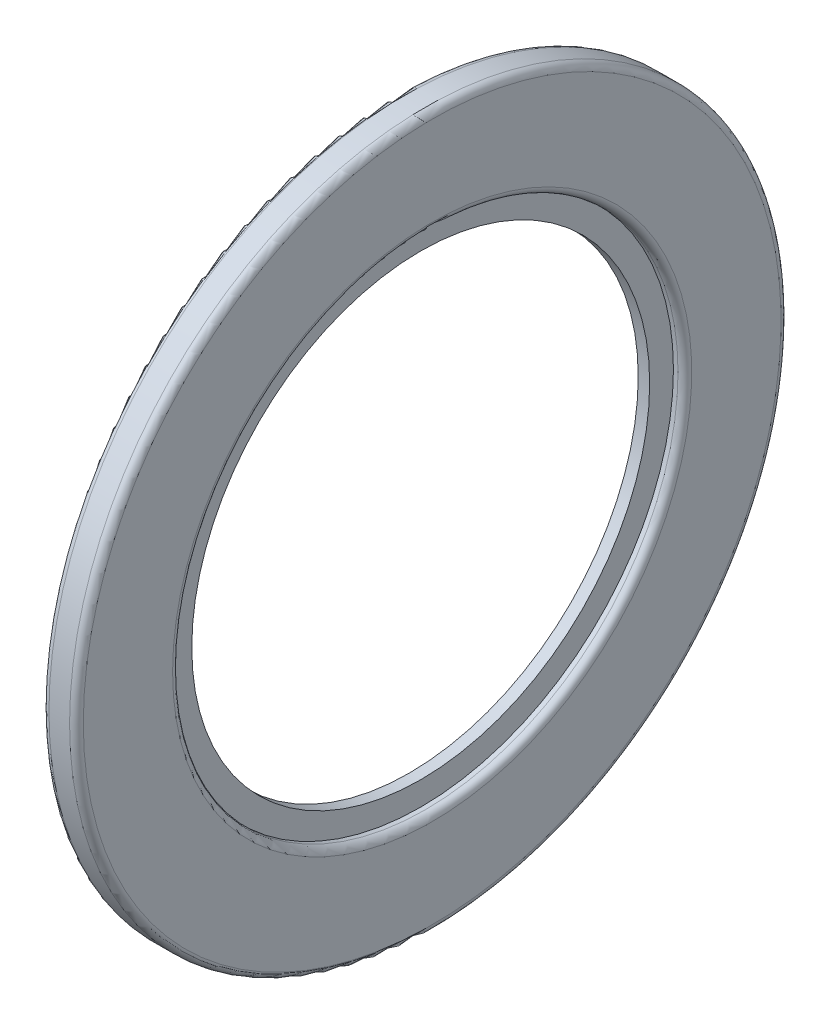
ISO-10303-21;
HEADER;
FILE_DESCRIPTION(('STEP AP214'),'2;1');
FILE_NAME('part.step','',(''),(''),'','','');
FILE_SCHEMA(('AUTOMOTIVE_DESIGN { 1 0 10303 214 1 1 1 1 }'));
ENDSEC;
DATA;
#1=APPLICATION_CONTEXT('core data for automotive mechanical design processes');
#2=APPLICATION_PROTOCOL_DEFINITION('international standard','automotive_design',2000,#1);
#3=PRODUCT_CONTEXT('',#1,'mechanical');
#4=PRODUCT('Part','Part','',(#3));
#5=PRODUCT_RELATED_PRODUCT_CATEGORY('part','',(#4));
#6=PRODUCT_DEFINITION_FORMATION('','',#4);
#7=PRODUCT_DEFINITION_CONTEXT('part definition',#1,'design');
#8=PRODUCT_DEFINITION('design','',#6,#7);
#9=PRODUCT_DEFINITION_SHAPE('','',#8);
#10=(LENGTH_UNIT() NAMED_UNIT(*) SI_UNIT(.MILLI.,.METRE.));
#11=(NAMED_UNIT(*) PLANE_ANGLE_UNIT() SI_UNIT($,.RADIAN.));
#12=(NAMED_UNIT(*) SI_UNIT($,.STERADIAN.) SOLID_ANGLE_UNIT());
#13=UNCERTAINTY_MEASURE_WITH_UNIT(LENGTH_MEASURE(1.E-05),#10,'distance_accuracy_value','');
#14=(GEOMETRIC_REPRESENTATION_CONTEXT(3) GLOBAL_UNCERTAINTY_ASSIGNED_CONTEXT((#13)) GLOBAL_UNIT_ASSIGNED_CONTEXT((#10,
#11,#12)) REPRESENTATION_CONTEXT('',''));
#15=CARTESIAN_POINT('',(0.,0.,0.));
#16=DIRECTION('',(0.,0.,1.));
#17=DIRECTION('',(1.,0.,0.));
#18=AXIS2_PLACEMENT_3D('',#15,#16,#17);
#19=CARTESIAN_POINT('',(-17.78,0.,0.));
#20=DIRECTION('',(-1.,0.,0.));
#21=DIRECTION('',(0.,0.,1.));
#22=AXIS2_PLACEMENT_3D('',#19,#20,#21);
#23=CYLINDRICAL_SURFACE('',#22,22.075);
#24=CARTESIAN_POINT('',(-0.500000000000004,0.,0.));
#25=DIRECTION('',(-1.,0.,0.));
#26=DIRECTION('',(0.,0.,1.));
#27=AXIS2_PLACEMENT_3D('',#24,#25,#26);
#28=CIRCLE('',#27,22.075);
#29=CARTESIAN_POINT('',(-0.500000000000004,0.,22.075));
#30=VERTEX_POINT('',#29);
#31=EDGE_CURVE('E47',#30,#30,#28,.T.);
#32=ORIENTED_EDGE('',*,*,#31,.F.);
#33=EDGE_LOOP('',(#32));
#34=FACE_BOUND('',#33,.T.);
#35=CARTESIAN_POINT('',(-0.900000000000001,0.,0.));
#36=DIRECTION('',(-1.,0.,0.));
#37=DIRECTION('',(0.,0.,1.));
#38=AXIS2_PLACEMENT_3D('',#35,#36,#37);
#39=CIRCLE('',#38,22.075);
#40=CARTESIAN_POINT('',(-0.900000000000001,0.,22.075));
#41=VERTEX_POINT('',#40);
#42=EDGE_CURVE('E53',#41,#41,#39,.T.);
#43=ORIENTED_EDGE('',*,*,#42,.T.);
#44=EDGE_LOOP('',(#43));
#45=FACE_BOUND('',#44,.T.);
#46=ADVANCED_FACE('F40',(#34,#45),#23,.F.);
#47=CARTESIAN_POINT('',(-0.900000000000003,0.,0.));
#48=DIRECTION('',(-1.,0.,0.));
#49=DIRECTION('',(0.,0.,1.));
#50=AXIS2_PLACEMENT_3D('',#47,#48,#49);
#51=TOROIDAL_SURFACE('',#50,22.675,0.600000000000002);
#52=ORIENTED_EDGE('',*,*,#42,.F.);
#53=EDGE_LOOP('',(#52));
#54=FACE_BOUND('',#53,.T.);
#55=CARTESIAN_POINT('',(-1.5,0.,0.));
#56=DIRECTION('',(-1.,0.,0.));
#57=DIRECTION('',(0.,0.,1.));
#58=AXIS2_PLACEMENT_3D('',#55,#56,#57);
#59=CIRCLE('',#58,22.675);
#60=CARTESIAN_POINT('',(-1.5,0.,22.675));
#61=VERTEX_POINT('',#60);
#62=EDGE_CURVE('E74',#61,#61,#59,.T.);
#63=ORIENTED_EDGE('',*,*,#62,.T.);
#64=EDGE_LOOP('',(#63));
#65=FACE_BOUND('',#64,.T.);
#66=ADVANCED_FACE('F79',(#54,#65),#51,.T.);
#67=CARTESIAN_POINT('',(0.499999999999997,0.,0.));
#68=DIRECTION('',(1.,0.,0.));
#69=DIRECTION('',(0.,0.,-1.));
#70=AXIS2_PLACEMENT_3D('',#67,#68,#69);
#71=CIRCLE('',#70,22.075);
#72=CARTESIAN_POINT('',(0.499999999999997,0.,-22.075));
#73=VERTEX_POINT('',#72);
#74=EDGE_CURVE('E41',#73,#73,#71,.T.);
#75=ORIENTED_EDGE('',*,*,#74,.F.);
#76=EDGE_LOOP('',(#75));
#77=FACE_BOUND('',#76,.T.);
#78=CARTESIAN_POINT('',(0.899999999999998,0.,0.));
#79=DIRECTION('',(-1.,0.,0.));
#80=DIRECTION('',(0.,0.,1.));
#81=AXIS2_PLACEMENT_3D('',#78,#79,#80);
#82=CIRCLE('',#81,22.075);
#83=CARTESIAN_POINT('',(0.899999999999998,0.,22.075));
#84=VERTEX_POINT('',#83);
#85=EDGE_CURVE('E60',#84,#84,#82,.T.);
#86=ORIENTED_EDGE('',*,*,#85,.F.);
#87=EDGE_LOOP('',(#86));
#88=FACE_BOUND('',#87,.T.);
#89=ADVANCED_FACE('F112',(#77,#88),#23,.F.);
#90=CARTESIAN_POINT('',(0.899999999999998,0.,0.));
#91=DIRECTION('',(-1.,0.,0.));
#92=DIRECTION('',(0.,0.,1.));
#93=AXIS2_PLACEMENT_3D('',#90,#91,#92);
#94=TOROIDAL_SURFACE('',#93,22.675,0.600000000000001);
#95=CARTESIAN_POINT('',(1.5,0.,0.));
#96=DIRECTION('',(-1.,0.,0.));
#97=DIRECTION('',(0.,0.,1.));
#98=AXIS2_PLACEMENT_3D('',#95,#96,#97);
#99=CIRCLE('',#98,22.675);
#100=CARTESIAN_POINT('',(1.5,0.,22.675));
#101=VERTEX_POINT('',#100);
#102=EDGE_CURVE('E58',#101,#101,#99,.T.);
#103=ORIENTED_EDGE('',*,*,#102,.F.);
#104=EDGE_LOOP('',(#103));
#105=FACE_BOUND('',#104,.T.);
#106=ORIENTED_EDGE('',*,*,#85,.T.);
#107=EDGE_LOOP('',(#106));
#108=FACE_BOUND('',#107,.T.);
#109=ADVANCED_FACE('F108',(#105,#108),#94,.T.);
#110=CARTESIAN_POINT('',(1.5,30.475,0.));
#111=DIRECTION('',(-1.,0.,0.));
#112=DIRECTION('',(0.,0.,1.));
#113=AXIS2_PLACEMENT_3D('',#110,#111,#112);
#114=PLANE('',#113);
#115=CARTESIAN_POINT('',(1.49999999999999,0.,0.));
#116=DIRECTION('',(-1.,0.,0.));
#117=DIRECTION('',(0.,0.,1.));
#118=AXIS2_PLACEMENT_3D('',#115,#116,#117);
#119=CIRCLE('',#118,30.475);
#120=CARTESIAN_POINT('',(1.49999999999999,0.,30.475));
#121=VERTEX_POINT('',#120);
#122=EDGE_CURVE('E62',#121,#121,#119,.T.);
#123=ORIENTED_EDGE('',*,*,#122,.F.);
#124=EDGE_LOOP('',(#123));
#125=FACE_BOUND('',#124,.T.);
#126=ORIENTED_EDGE('',*,*,#102,.T.);
#127=EDGE_LOOP('',(#126));
#128=FACE_BOUND('',#127,.T.);
#129=ADVANCED_FACE('F105',(#125,#128),#114,.F.);
#130=CARTESIAN_POINT('',(0.899999999999996,0.,0.));
#131=DIRECTION('',(-1.,0.,0.));
#132=DIRECTION('',(0.,0.,1.));
#133=AXIS2_PLACEMENT_3D('',#130,#131,#132);
#134=TOROIDAL_SURFACE('',#133,30.475,0.6);
#135=CARTESIAN_POINT('',(0.899999999999998,0.,0.));
#136=DIRECTION('',(-1.,0.,0.));
#137=DIRECTION('',(0.,0.,1.));
#138=AXIS2_PLACEMENT_3D('',#135,#136,#137);
#139=CIRCLE('',#138,31.075);
#140=CARTESIAN_POINT('',(0.899999999999998,0.,31.075));
#141=VERTEX_POINT('',#140);
#142=EDGE_CURVE('E68',#141,#141,#139,.T.);
#143=ORIENTED_EDGE('',*,*,#142,.F.);
#144=EDGE_LOOP('',(#143));
#145=FACE_BOUND('',#144,.T.);
#146=ORIENTED_EDGE('',*,*,#122,.T.);
#147=EDGE_LOOP('',(#146));
#148=FACE_BOUND('',#147,.T.);
#149=ADVANCED_FACE('F98',(#145,#148),#134,.T.);
#150=CARTESIAN_POINT('',(-17.78,0.,0.));
#151=DIRECTION('',(-1.,0.,0.));
#152=DIRECTION('',(0.,0.,1.));
#153=AXIS2_PLACEMENT_3D('',#150,#151,#152);
#154=CYLINDRICAL_SURFACE('',#153,31.075);
#155=CARTESIAN_POINT('',(-0.900000000000005,0.,0.));
#156=DIRECTION('',(-1.,0.,0.));
#157=DIRECTION('',(0.,0.,1.));
#158=AXIS2_PLACEMENT_3D('',#155,#156,#157);
#159=CIRCLE('',#158,31.075);
#160=CARTESIAN_POINT('',(-0.900000000000005,0.,31.075));
#161=VERTEX_POINT('',#160);
#162=EDGE_CURVE('E70',#161,#161,#159,.T.);
#163=ORIENTED_EDGE('',*,*,#162,.F.);
#164=EDGE_LOOP('',(#163));
#165=FACE_BOUND('',#164,.T.);
#166=ORIENTED_EDGE('',*,*,#142,.T.);
#167=EDGE_LOOP('',(#166));
#168=FACE_BOUND('',#167,.T.);
#169=ADVANCED_FACE('F86',(#165,#168),#154,.T.);
#170=CARTESIAN_POINT('',(-0.900000000000004,0.,0.));
#171=DIRECTION('',(-1.,0.,0.));
#172=DIRECTION('',(0.,0.,1.));
#173=AXIS2_PLACEMENT_3D('',#170,#171,#172);
#174=TOROIDAL_SURFACE('',#173,30.475,0.6);
#175=CARTESIAN_POINT('',(-1.5,0.,0.));
#176=DIRECTION('',(-1.,0.,0.));
#177=DIRECTION('',(0.,0.,1.));
#178=AXIS2_PLACEMENT_3D('',#175,#176,#177);
#179=CIRCLE('',#178,30.475);
#180=CARTESIAN_POINT('',(-1.5,0.,30.475));
#181=VERTEX_POINT('',#180);
#182=EDGE_CURVE('E75',#181,#181,#179,.T.);
#183=ORIENTED_EDGE('',*,*,#182,.F.);
#184=EDGE_LOOP('',(#183));
#185=FACE_BOUND('',#184,.T.);
#186=ORIENTED_EDGE('',*,*,#162,.T.);
#187=EDGE_LOOP('',(#186));
#188=FACE_BOUND('',#187,.T.);
#189=ADVANCED_FACE('F85',(#185,#188),#174,.T.);
#190=CARTESIAN_POINT('',(-1.5,30.475,0.));
#191=DIRECTION('',(1.,0.,0.));
#192=DIRECTION('',(0.,0.,-1.));
#193=AXIS2_PLACEMENT_3D('',#190,#191,#192);
#194=PLANE('',#193);
#195=ORIENTED_EDGE('',*,*,#62,.F.);
#196=EDGE_LOOP('',(#195));
#197=FACE_BOUND('',#196,.T.);
#198=ORIENTED_EDGE('',*,*,#182,.T.);
#199=EDGE_LOOP('',(#198));
#200=FACE_BOUND('',#199,.T.);
#201=ADVANCED_FACE('F83',(#197,#200),#194,.F.);
#202=CARTESIAN_POINT('',(-0.500000000000003,30.,0.));
#203=DIRECTION('',(-1.,0.,0.));
#204=DIRECTION('',(0.,0.,1.));
#205=AXIS2_PLACEMENT_3D('',#202,#203,#204);
#206=PLANE('',#205);
#207=CARTESIAN_POINT('',(-0.5,0.,0.));
#208=DIRECTION('',(1.,0.,0.));
#209=DIRECTION('',(0.,0.,-1.));
#210=AXIS2_PLACEMENT_3D('',#207,#208,#209);
#211=CIRCLE('',#210,20.);
#212=CARTESIAN_POINT('',(-0.5,0.,-20.));
#213=VERTEX_POINT('',#212);
#214=EDGE_CURVE('E10',#213,#213,#211,.T.);
#215=ORIENTED_EDGE('',*,*,#214,.T.);
#216=EDGE_LOOP('',(#215));
#217=FACE_BOUND('',#216,.T.);
#218=ORIENTED_EDGE('',*,*,#31,.T.);
#219=EDGE_LOOP('',(#218));
#220=FACE_BOUND('',#219,.T.);
#221=ADVANCED_FACE('F39',(#217,#220),#206,.T.);
#222=CARTESIAN_POINT('',(0.499999999999997,30.,0.));
#223=DIRECTION('',(1.,0.,0.));
#224=DIRECTION('',(0.,0.,-1.));
#225=AXIS2_PLACEMENT_3D('',#222,#223,#224);
#226=PLANE('',#225);
#227=CARTESIAN_POINT('',(0.5,0.,0.));
#228=DIRECTION('',(1.,0.,0.));
#229=DIRECTION('',(0.,0.,-1.));
#230=AXIS2_PLACEMENT_3D('',#227,#228,#229);
#231=CIRCLE('',#230,20.);
#232=CARTESIAN_POINT('',(0.5,0.,-20.));
#233=VERTEX_POINT('',#232);
#234=EDGE_CURVE('E44',#233,#233,#231,.T.);
#235=ORIENTED_EDGE('',*,*,#234,.F.);
#236=EDGE_LOOP('',(#235));
#237=FACE_BOUND('',#236,.T.);
#238=ORIENTED_EDGE('',*,*,#74,.T.);
#239=EDGE_LOOP('',(#238));
#240=FACE_BOUND('',#239,.T.);
#241=ADVANCED_FACE('F140',(#237,#240),#226,.T.);
#242=CARTESIAN_POINT('',(-34.925,0.,0.));
#243=DIRECTION('',(1.,0.,0.));
#244=DIRECTION('',(0.,0.,-1.));
#245=AXIS2_PLACEMENT_3D('',#242,#243,#244);
#246=CYLINDRICAL_SURFACE('',#245,20.);
#247=ORIENTED_EDGE('',*,*,#234,.T.);
#248=EDGE_LOOP('',(#247));
#249=FACE_BOUND('',#248,.T.);
#250=ORIENTED_EDGE('',*,*,#214,.F.);
#251=EDGE_LOOP('',(#250));
#252=FACE_BOUND('',#251,.T.);
#253=ADVANCED_FACE('F142',(#249,#252),#246,.F.);
#254=CLOSED_SHELL('',(#46,#66,#89,#109,#129,#149,#169,#189,#201,#221,#241,#253));
#255=MANIFOLD_SOLID_BREP('B2',#254);
#256=ADVANCED_BREP_SHAPE_REPRESENTATION('',(#18,#255),#14);
#257=SHAPE_DEFINITION_REPRESENTATION(#9,#256);
ENDSEC;
END-ISO-10303-21;
